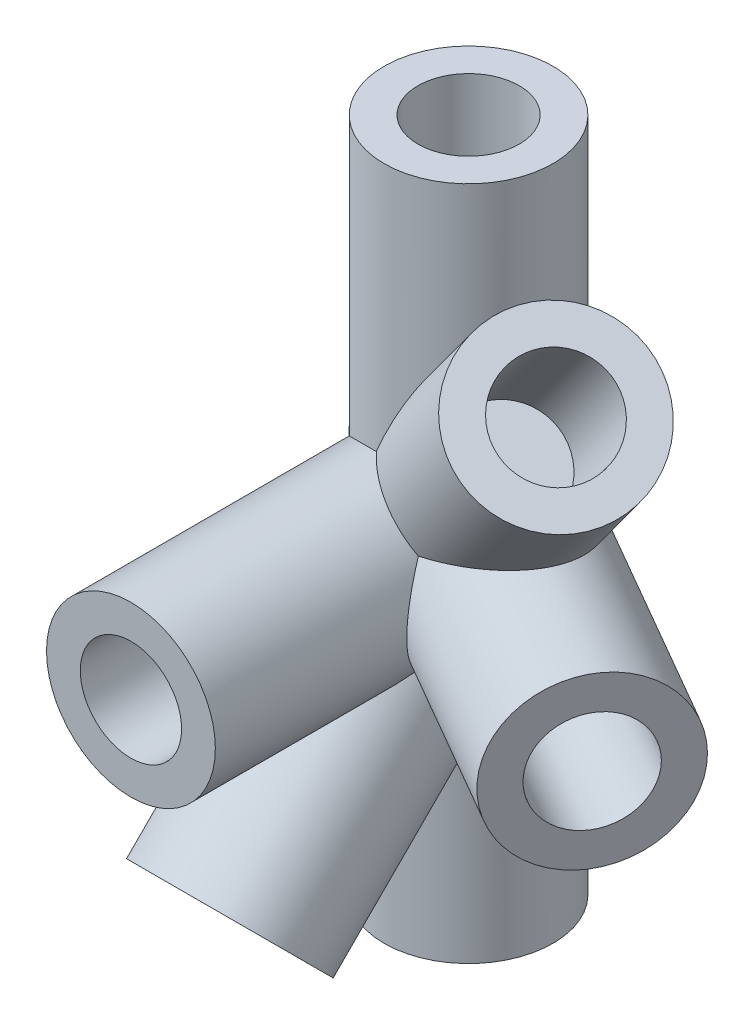
ISO-10303-21;
HEADER;
FILE_DESCRIPTION(('STEP AP214'),'2;1');
FILE_NAME('part.step','',(''),(''),'','','');
FILE_SCHEMA(('AUTOMOTIVE_DESIGN { 1 0 10303 214 1 1 1 1 }'));
ENDSEC;
DATA;
#1=APPLICATION_CONTEXT('core data for automotive mechanical design processes');
#2=APPLICATION_PROTOCOL_DEFINITION('international standard','automotive_design',2000,#1);
#3=PRODUCT_CONTEXT('',#1,'mechanical');
#4=PRODUCT('Part','Part','',(#3));
#5=PRODUCT_RELATED_PRODUCT_CATEGORY('part','',(#4));
#6=PRODUCT_DEFINITION_FORMATION('','',#4);
#7=PRODUCT_DEFINITION_CONTEXT('part definition',#1,'design');
#8=PRODUCT_DEFINITION('design','',#6,#7);
#9=PRODUCT_DEFINITION_SHAPE('','',#8);
#10=(LENGTH_UNIT() NAMED_UNIT(*) SI_UNIT(.MILLI.,.METRE.));
#11=(NAMED_UNIT(*) PLANE_ANGLE_UNIT() SI_UNIT($,.RADIAN.));
#12=(NAMED_UNIT(*) SI_UNIT($,.STERADIAN.) SOLID_ANGLE_UNIT());
#13=UNCERTAINTY_MEASURE_WITH_UNIT(LENGTH_MEASURE(1.E-05),#10,'distance_accuracy_value','');
#14=(GEOMETRIC_REPRESENTATION_CONTEXT(3) GLOBAL_UNCERTAINTY_ASSIGNED_CONTEXT((#13)) GLOBAL_UNIT_ASSIGNED_CONTEXT((#10,
#11,#12)) REPRESENTATION_CONTEXT('',''));
#15=CARTESIAN_POINT('',(0.,0.,0.));
#16=DIRECTION('',(0.,0.,1.));
#17=DIRECTION('',(1.,0.,0.));
#18=AXIS2_PLACEMENT_3D('',#15,#16,#17);
#19=CARTESIAN_POINT('',(20.6349642678086,20.,11.9136021747375));
#20=DIRECTION('',(-0.86602540378444,0.,-0.499999999999998));
#21=DIRECTION('',(-0.499999999999998,0.,0.86602540378444));
#22=AXIS2_PLACEMENT_3D('',#19,#20,#21);
#23=CYLINDRICAL_SURFACE('',#22,5.);
#24=CARTESIAN_POINT('',(17.3205080756888,20.,9.99999999999995));
#25=DIRECTION('',(0.86602540378444,0.,0.499999999999998));
#26=DIRECTION('',(0.499999999999998,0.,-0.86602540378444));
#27=AXIS2_PLACEMENT_3D('',#24,#25,#26);
#28=CIRCLE('',#27,5.);
#29=CARTESIAN_POINT('',(19.8205080756888,20.,5.66987298107775));
#30=VERTEX_POINT('',#29);
#31=EDGE_CURVE('E77',#30,#30,#28,.T.);
#32=ORIENTED_EDGE('',*,*,#31,.F.);
#33=EDGE_LOOP('',(#32));
#34=FACE_BOUND('',#33,.T.);
#35=CARTESIAN_POINT('',(0.,20.,0.));
#36=DIRECTION('',(-0.331413574035592,0.923879532511287,-0.191341716182543));
#37=DIRECTION('',(-0.800103145191267,-0.38268343236509,-0.461939766255641));
#38=AXIS2_PLACEMENT_3D('',#35,#36,#37);
#39=ELLIPSE('',#38,13.0656296487638,5.);
#40=CARTESIAN_POINT('',(4.06259960034373,22.9146671314726,7.03662891860434));
#41=VERTEX_POINT('',#40);
#42=CARTESIAN_POINT('',(2.49999999999999,20.,-4.3301270189222));
#43=VERTEX_POINT('',#42);
#44=EDGE_CURVE('E80',#41,#43,#39,.T.);
#45=ORIENTED_EDGE('',*,*,#44,.F.);
#46=CARTESIAN_POINT('',(0.,20.,0.));
#47=DIRECTION('',(0.866025403784438,0.,-0.500000000000001));
#48=DIRECTION('',(-0.500000000000001,0.,-0.866025403784438));
#49=AXIS2_PLACEMENT_3D('',#46,#47,#48);
#50=ELLIPSE('',#49,9.99999999999998,5.);
#51=CARTESIAN_POINT('',(4.06259960034373,17.0853328685274,7.03662891860434));
#52=VERTEX_POINT('',#51);
#53=EDGE_CURVE('E68',#41,#52,#50,.T.);
#54=ORIENTED_EDGE('',*,*,#53,.T.);
#55=CARTESIAN_POINT('',(0.,20.,0.));
#56=DIRECTION('',(0.761639225784925,0.621875823753831,-0.182143211721529));
#57=DIRECTION('',(-0.526354012893032,0.429766251884748,-0.733656882917578));
#58=AXIS2_PLACEMENT_3D('',#55,#56,#57);
#59=ELLIPSE('',#58,8.79465224064609,5.);
#60=CARTESIAN_POINT('',(4.5554755796027,15.0243519749615,2.06098089356585));
#61=VERTEX_POINT('',#60);
#62=EDGE_CURVE('E44',#52,#61,#59,.T.);
#63=ORIENTED_EDGE('',*,*,#62,.T.);
#64=CARTESIAN_POINT('',(0.,20.,0.));
#65=DIRECTION('',(-0.612372435695795,-0.707106781186547,-0.353553390593272));
#66=DIRECTION('',(0.612372435695795,-0.707106781186547,0.353553390593272));
#67=AXIS2_PLACEMENT_3D('',#64,#65,#66);
#68=ELLIPSE('',#67,7.07106781186548,5.);
#69=EDGE_CURVE('E76',#61,#43,#68,.F.);
#70=ORIENTED_EDGE('',*,*,#69,.T.);
#71=EDGE_LOOP('',(#45,#54,#63,#70));
#72=FACE_BOUND('',#71,.T.);
#73=ADVANCED_FACE('F36',(#34,#72),#23,.T.);
#74=CARTESIAN_POINT('',(0.,40.,0.));
#75=DIRECTION('',(0.,-1.,0.));
#76=DIRECTION('',(0.,0.,-1.));
#77=AXIS2_PLACEMENT_3D('',#74,#75,#76);
#78=CYLINDRICAL_SURFACE('',#77,5.);
#79=CARTESIAN_POINT('',(0.,40.,0.));
#80=DIRECTION('',(0.,1.,0.));
#81=DIRECTION('',(0.,0.,1.));
#82=AXIS2_PLACEMENT_3D('',#79,#80,#81);
#83=CIRCLE('',#82,5.);
#84=CARTESIAN_POINT('',(0.,40.,5.));
#85=VERTEX_POINT('',#84);
#86=EDGE_CURVE('E103',#85,#85,#83,.T.);
#87=ORIENTED_EDGE('',*,*,#86,.F.);
#88=EDGE_LOOP('',(#87));
#89=FACE_BOUND('',#88,.T.);
#90=CARTESIAN_POINT('',(0.,0.,0.));
#91=DIRECTION('',(0.,1.,0.));
#92=DIRECTION('',(0.,0.,1.));
#93=AXIS2_PLACEMENT_3D('',#90,#91,#92);
#94=CIRCLE('',#93,5.);
#95=CARTESIAN_POINT('',(0.,0.,5.));
#96=VERTEX_POINT('',#95);
#97=EDGE_CURVE('E102',#96,#96,#94,.T.);
#98=ORIENTED_EDGE('',*,*,#97,.T.);
#99=EDGE_LOOP('',(#98));
#100=FACE_BOUND('',#99,.T.);
#101=CARTESIAN_POINT('',(0.,20.,0.));
#102=DIRECTION('',(0.800103145191267,-0.38268343236509,0.461939766255641));
#103=DIRECTION('',(-0.331413574035593,-0.923879532511287,-0.191341716182544));
#104=AXIS2_PLACEMENT_3D('',#101,#102,#103);
#105=ELLIPSE('',#104,13.0656296487638,5.);
#106=CARTESIAN_POINT('',(-0.492875979258956,24.9756480250385,4.9756480250385));
#107=VERTEX_POINT('',#106);
#108=EDGE_CURVE('E56',#43,#107,#105,.T.);
#109=ORIENTED_EDGE('',*,*,#108,.F.);
#110=ORIENTED_EDGE('',*,*,#69,.F.);
#111=CARTESIAN_POINT('',(0.,20.,0.));
#112=DIRECTION('',(0.,-0.38268343236509,-0.923879532511287));
#113=DIRECTION('',(0.,-0.923879532511287,0.38268343236509));
#114=AXIS2_PLACEMENT_3D('',#111,#112,#113);
#115=ELLIPSE('',#114,13.0656296487638,5.);
#116=CARTESIAN_POINT('',(-5.,20.,0.));
#117=VERTEX_POINT('',#116);
#118=EDGE_CURVE('E97',#117,#61,#115,.F.);
#119=ORIENTED_EDGE('',*,*,#118,.F.);
#120=CARTESIAN_POINT('',(0.,20.,0.));
#121=DIRECTION('',(0.,-0.707106781186547,0.707106781186547));
#122=DIRECTION('',(0.,-0.707106781186547,-0.707106781186547));
#123=AXIS2_PLACEMENT_3D('',#120,#121,#122);
#124=ELLIPSE('',#123,7.07106781186548,5.);
#125=EDGE_CURVE('E106',#107,#117,#124,.T.);
#126=ORIENTED_EDGE('',*,*,#125,.F.);
#127=EDGE_LOOP('',(#109,#110,#119,#126));
#128=FACE_BOUND('',#127,.T.);
#129=ADVANCED_FACE('F38',(#89,#100,#128),#78,.T.);
#130=CARTESIAN_POINT('',(0.,20.,20.));
#131=DIRECTION('',(0.,0.,-1.));
#132=DIRECTION('',(-1.,0.,0.));
#133=AXIS2_PLACEMENT_3D('',#130,#131,#132);
#134=CYLINDRICAL_SURFACE('',#133,5.);
#135=CARTESIAN_POINT('',(0.,20.,20.));
#136=DIRECTION('',(0.,0.,1.));
#137=DIRECTION('',(1.,0.,0.));
#138=AXIS2_PLACEMENT_3D('',#135,#136,#137);
#139=CIRCLE('',#138,5.);
#140=CARTESIAN_POINT('',(5.,20.,20.));
#141=VERTEX_POINT('',#140);
#142=EDGE_CURVE('E99',#141,#141,#139,.T.);
#143=ORIENTED_EDGE('',*,*,#142,.F.);
#144=EDGE_LOOP('',(#143));
#145=FACE_BOUND('',#144,.T.);
#146=CARTESIAN_POINT('',(0.,20.,0.));
#147=DIRECTION('',(0.538560261370193,0.621875823753831,-0.568527312187694));
#148=DIRECTION('',(-0.372188491821415,-0.429766251884748,-0.822664388008036));
#149=AXIS2_PLACEMENT_3D('',#146,#147,#148);
#150=ELLIPSE('',#149,8.79465224064609,5.);
#151=EDGE_CURVE('E11',#107,#41,#150,.T.);
#152=ORIENTED_EDGE('',*,*,#151,.F.);
#153=ORIENTED_EDGE('',*,*,#125,.T.);
#154=CARTESIAN_POINT('',(0.,20.,0.));
#155=DIRECTION('',(0.,-0.923879532511287,-0.38268343236509));
#156=DIRECTION('',(0.,0.38268343236509,-0.923879532511287));
#157=AXIS2_PLACEMENT_3D('',#154,#155,#156);
#158=ELLIPSE('',#157,13.0656296487638,5.);
#159=EDGE_CURVE('E72',#52,#117,#158,.T.);
#160=ORIENTED_EDGE('',*,*,#159,.F.);
#161=ORIENTED_EDGE('',*,*,#53,.F.);
#162=EDGE_LOOP('',(#152,#153,#160,#161));
#163=FACE_BOUND('',#162,.T.);
#164=ADVANCED_FACE('F70',(#145,#163),#134,.T.);
#165=CARTESIAN_POINT('',(0.,5.85786437626906,14.1421356237309));
#166=DIRECTION('',(0.,0.707106781186547,-0.707106781186548));
#167=DIRECTION('',(0.,0.707106781186548,0.707106781186547));
#168=AXIS2_PLACEMENT_3D('',#165,#166,#167);
#169=CYLINDRICAL_SURFACE('',#168,5.);
#170=CARTESIAN_POINT('',(0.,5.85786437626906,14.1421356237309));
#171=DIRECTION('',(0.,-0.707106781186547,0.707106781186548));
#172=DIRECTION('',(0.,-0.707106781186548,-0.707106781186547));
#173=AXIS2_PLACEMENT_3D('',#170,#171,#172);
#174=CIRCLE('',#173,5.);
#175=CARTESIAN_POINT('',(0.,2.32233047033632,10.6066017177982));
#176=VERTEX_POINT('',#175);
#177=EDGE_CURVE('E94',#176,#176,#174,.T.);
#178=ORIENTED_EDGE('',*,*,#177,.F.);
#179=EDGE_LOOP('',(#178));
#180=FACE_BOUND('',#179,.T.);
#181=ORIENTED_EDGE('',*,*,#62,.F.);
#182=ORIENTED_EDGE('',*,*,#159,.T.);
#183=ORIENTED_EDGE('',*,*,#118,.T.);
#184=EDGE_LOOP('',(#181,#182,#183));
#185=FACE_BOUND('',#184,.T.);
#186=ADVANCED_FACE('F111',(#180,#185),#169,.T.);
#187=CARTESIAN_POINT('',(0.,40.,0.));
#188=DIRECTION('',(0.,1.,0.));
#189=DIRECTION('',(0.,0.,1.));
#190=AXIS2_PLACEMENT_3D('',#187,#188,#189);
#191=PLANE('',#190);
#192=CARTESIAN_POINT('',(0.,40.,0.));
#193=DIRECTION('',(0.,1.,0.));
#194=DIRECTION('',(0.,0.,1.));
#195=AXIS2_PLACEMENT_3D('',#192,#193,#194);
#196=CIRCLE('',#195,3.);
#197=CARTESIAN_POINT('',(0.,40.,3.));
#198=VERTEX_POINT('',#197);
#199=EDGE_CURVE('E239',#198,#198,#196,.T.);
#200=ORIENTED_EDGE('',*,*,#199,.F.);
#201=EDGE_LOOP('',(#200));
#202=FACE_BOUND('',#201,.T.);
#203=ORIENTED_EDGE('',*,*,#86,.T.);
#204=EDGE_LOOP('',(#203));
#205=FACE_BOUND('',#204,.T.);
#206=ADVANCED_FACE('F130',(#202,#205),#191,.T.);
#207=CARTESIAN_POINT('',(0.,0.,0.));
#208=DIRECTION('',(0.,1.,0.));
#209=DIRECTION('',(0.,0.,1.));
#210=AXIS2_PLACEMENT_3D('',#207,#208,#209);
#211=PLANE('',#210);
#212=CARTESIAN_POINT('',(0.,0.,0.));
#213=DIRECTION('',(0.,-1.,0.));
#214=DIRECTION('',(0.,0.,-1.));
#215=AXIS2_PLACEMENT_3D('',#212,#213,#214);
#216=CIRCLE('',#215,3.);
#217=CARTESIAN_POINT('',(0.,0.,-3.));
#218=VERTEX_POINT('',#217);
#219=EDGE_CURVE('E233',#218,#218,#216,.T.);
#220=ORIENTED_EDGE('',*,*,#219,.F.);
#221=EDGE_LOOP('',(#220));
#222=FACE_BOUND('',#221,.T.);
#223=ORIENTED_EDGE('',*,*,#97,.F.);
#224=EDGE_LOOP('',(#223));
#225=FACE_BOUND('',#224,.T.);
#226=ADVANCED_FACE('F127',(#222,#225),#211,.F.);
#227=CARTESIAN_POINT('',(0.,20.,20.));
#228=DIRECTION('',(0.,0.,1.));
#229=DIRECTION('',(1.,0.,0.));
#230=AXIS2_PLACEMENT_3D('',#227,#228,#229);
#231=PLANE('',#230);
#232=CARTESIAN_POINT('',(0.,20.,20.));
#233=DIRECTION('',(0.,0.,1.));
#234=DIRECTION('',(1.,0.,0.));
#235=AXIS2_PLACEMENT_3D('',#232,#233,#234);
#236=CIRCLE('',#235,3.);
#237=CARTESIAN_POINT('',(3.,20.,20.));
#238=VERTEX_POINT('',#237);
#239=EDGE_CURVE('E222',#238,#238,#236,.T.);
#240=ORIENTED_EDGE('',*,*,#239,.F.);
#241=EDGE_LOOP('',(#240));
#242=FACE_BOUND('',#241,.T.);
#243=ORIENTED_EDGE('',*,*,#142,.T.);
#244=EDGE_LOOP('',(#243));
#245=FACE_BOUND('',#244,.T.);
#246=ADVANCED_FACE('F129',(#242,#245),#231,.T.);
#247=CARTESIAN_POINT('',(0.,5.85786437626906,14.1421356237309));
#248=DIRECTION('',(0.,-0.707106781186547,0.707106781186548));
#249=DIRECTION('',(0.,-0.707106781186548,-0.707106781186547));
#250=AXIS2_PLACEMENT_3D('',#247,#248,#249);
#251=PLANE('',#250);
#252=CARTESIAN_POINT('',(0.,5.85786437626906,14.1421356237309));
#253=DIRECTION('',(0.,-0.707106781186548,0.707106781186548));
#254=DIRECTION('',(0.,-0.707106781186548,-0.707106781186548));
#255=AXIS2_PLACEMENT_3D('',#252,#253,#254);
#256=CIRCLE('',#255,3.);
#257=CARTESIAN_POINT('',(0.,3.73654403270942,12.0208152801713));
#258=VERTEX_POINT('',#257);
#259=EDGE_CURVE('E227',#258,#258,#256,.T.);
#260=ORIENTED_EDGE('',*,*,#259,.F.);
#261=EDGE_LOOP('',(#260));
#262=FACE_BOUND('',#261,.T.);
#263=ORIENTED_EDGE('',*,*,#177,.T.);
#264=EDGE_LOOP('',(#263));
#265=FACE_BOUND('',#264,.T.);
#266=ADVANCED_FACE('F136',(#262,#265),#251,.T.);
#267=CARTESIAN_POINT('',(17.3205080756888,20.,9.99999999999995));
#268=DIRECTION('',(0.86602540378444,0.,0.499999999999998));
#269=DIRECTION('',(0.499999999999998,0.,-0.86602540378444));
#270=AXIS2_PLACEMENT_3D('',#267,#268,#269);
#271=PLANE('',#270);
#272=CARTESIAN_POINT('',(17.3205080756888,20.,9.99999999999995));
#273=DIRECTION('',(0.86602540378444,0.,0.499999999999998));
#274=DIRECTION('',(0.499999999999998,0.,-0.86602540378444));
#275=AXIS2_PLACEMENT_3D('',#272,#273,#274);
#276=CIRCLE('',#275,3.);
#277=CARTESIAN_POINT('',(18.8205080756888,20.,7.40192378864663));
#278=VERTEX_POINT('',#277);
#279=EDGE_CURVE('E212',#278,#278,#276,.T.);
#280=ORIENTED_EDGE('',*,*,#279,.F.);
#281=EDGE_LOOP('',(#280));
#282=FACE_BOUND('',#281,.T.);
#283=ORIENTED_EDGE('',*,*,#31,.T.);
#284=EDGE_LOOP('',(#283));
#285=FACE_BOUND('',#284,.T.);
#286=ADVANCED_FACE('F147',(#282,#285),#271,.T.);
#287=CARTESIAN_POINT('',(12.2474487139159,34.142135623731,7.07106781186546));
#288=DIRECTION('',(-0.612372435695796,-0.707106781186547,-0.353553390593273));
#289=DIRECTION('',(0.755928946018454,-0.654653670707978,0.));
#290=AXIS2_PLACEMENT_3D('',#287,#288,#289);
#291=CYLINDRICAL_SURFACE('',#290,5.);
#292=CARTESIAN_POINT('',(12.2474487139159,34.142135623731,7.07106781186546));
#293=DIRECTION('',(0.612372435695796,0.707106781186547,0.353553390593273));
#294=DIRECTION('',(-0.755928946018454,0.654653670707978,0.));
#295=AXIS2_PLACEMENT_3D('',#292,#293,#294);
#296=CIRCLE('',#295,5.);
#297=CARTESIAN_POINT('',(8.46780398382366,37.4154039772708,7.07106781186546));
#298=VERTEX_POINT('',#297);
#299=EDGE_CURVE('E84',#298,#298,#296,.T.);
#300=ORIENTED_EDGE('',*,*,#299,.F.);
#301=EDGE_LOOP('',(#300));
#302=FACE_BOUND('',#301,.T.);
#303=ORIENTED_EDGE('',*,*,#151,.T.);
#304=ORIENTED_EDGE('',*,*,#44,.T.);
#305=ORIENTED_EDGE('',*,*,#108,.T.);
#306=EDGE_LOOP('',(#303,#304,#305));
#307=FACE_BOUND('',#306,.T.);
#308=ADVANCED_FACE('F83',(#302,#307),#291,.T.);
#309=CARTESIAN_POINT('',(12.2474487139159,34.142135623731,7.07106781186546));
#310=DIRECTION('',(0.612372435695796,0.707106781186547,0.353553390593273));
#311=DIRECTION('',(-0.755928946018454,0.654653670707978,0.));
#312=AXIS2_PLACEMENT_3D('',#309,#310,#311);
#313=PLANE('',#312);
#314=CARTESIAN_POINT('',(12.2474487139159,34.142135623731,7.07106781186546));
#315=DIRECTION('',(0.612372435695796,0.707106781186547,0.353553390593272));
#316=DIRECTION('',(-0.755928946018454,0.654653670707978,0.));
#317=AXIS2_PLACEMENT_3D('',#314,#315,#316);
#318=CIRCLE('',#317,3.);
#319=CARTESIAN_POINT('',(9.97966187586057,36.1060966358549,7.07106781186546));
#320=VERTEX_POINT('',#319);
#321=EDGE_CURVE('E213',#320,#320,#318,.T.);
#322=ORIENTED_EDGE('',*,*,#321,.F.);
#323=EDGE_LOOP('',(#322));
#324=FACE_BOUND('',#323,.T.);
#325=ORIENTED_EDGE('',*,*,#299,.T.);
#326=EDGE_LOOP('',(#325));
#327=FACE_BOUND('',#326,.T.);
#328=ADVANCED_FACE('F155',(#324,#327),#313,.T.);
#329=CARTESIAN_POINT('',(0.,28.,0.));
#330=DIRECTION('',(0.,1.,0.));
#331=DIRECTION('',(0.,0.,1.));
#332=AXIS2_PLACEMENT_3D('',#329,#330,#331);
#333=CYLINDRICAL_SURFACE('',#332,3.);
#334=CARTESIAN_POINT('',(0.,28.,0.));
#335=DIRECTION('',(0.,1.,0.));
#336=DIRECTION('',(0.,0.,1.));
#337=AXIS2_PLACEMENT_3D('',#334,#335,#336);
#338=CIRCLE('',#337,3.);
#339=CARTESIAN_POINT('',(0.,28.,3.));
#340=VERTEX_POINT('',#339);
#341=EDGE_CURVE('E87',#340,#340,#338,.T.);
#342=ORIENTED_EDGE('',*,*,#341,.F.);
#343=EDGE_LOOP('',(#342));
#344=FACE_BOUND('',#343,.T.);
#345=ORIENTED_EDGE('',*,*,#199,.T.);
#346=EDGE_LOOP('',(#345));
#347=FACE_BOUND('',#346,.T.);
#348=ADVANCED_FACE('F159',(#344,#347),#333,.F.);
#349=CARTESIAN_POINT('',(0.,28.,0.));
#350=DIRECTION('',(0.,1.,0.));
#351=DIRECTION('',(0.,0.,1.));
#352=AXIS2_PLACEMENT_3D('',#349,#350,#351);
#353=PLANE('',#352);
#354=ORIENTED_EDGE('',*,*,#341,.T.);
#355=EDGE_LOOP('',(#354));
#356=FACE_BOUND('',#355,.T.);
#357=ADVANCED_FACE('F163',(#356),#353,.T.);
#358=CARTESIAN_POINT('',(0.,12.,0.));
#359=DIRECTION('',(0.,-1.,0.));
#360=DIRECTION('',(0.,0.,-1.));
#361=AXIS2_PLACEMENT_3D('',#358,#359,#360);
#362=CYLINDRICAL_SURFACE('',#361,3.);
#363=CARTESIAN_POINT('',(0.,12.,0.));
#364=DIRECTION('',(0.,-1.,0.));
#365=DIRECTION('',(0.,0.,-1.));
#366=AXIS2_PLACEMENT_3D('',#363,#364,#365);
#367=CIRCLE('',#366,3.);
#368=CARTESIAN_POINT('',(0.,12.,-3.));
#369=VERTEX_POINT('',#368);
#370=EDGE_CURVE('E236',#369,#369,#367,.T.);
#371=ORIENTED_EDGE('',*,*,#370,.F.);
#372=EDGE_LOOP('',(#371));
#373=FACE_BOUND('',#372,.T.);
#374=ORIENTED_EDGE('',*,*,#219,.T.);
#375=EDGE_LOOP('',(#374));
#376=FACE_BOUND('',#375,.T.);
#377=ADVANCED_FACE('F167',(#373,#376),#362,.F.);
#378=CARTESIAN_POINT('',(0.,12.,0.));
#379=DIRECTION('',(0.,-1.,0.));
#380=DIRECTION('',(0.,0.,-1.));
#381=AXIS2_PLACEMENT_3D('',#378,#379,#380);
#382=PLANE('',#381);
#383=ORIENTED_EDGE('',*,*,#370,.T.);
#384=EDGE_LOOP('',(#383));
#385=FACE_BOUND('',#384,.T.);
#386=ADVANCED_FACE('F171',(#385),#382,.T.);
#387=CARTESIAN_POINT('',(0.,14.3431457505076,5.65685424949238));
#388=DIRECTION('',(0.,-0.707106781186547,0.707106781186547));
#389=DIRECTION('',(0.,-0.707106781186548,-0.707106781186548));
#390=AXIS2_PLACEMENT_3D('',#387,#388,#389);
#391=CYLINDRICAL_SURFACE('',#390,3.);
#392=CARTESIAN_POINT('',(0.,14.3431457505076,5.65685424949238));
#393=DIRECTION('',(0.,-0.707106781186548,0.707106781186548));
#394=DIRECTION('',(0.,-0.707106781186548,-0.707106781186548));
#395=AXIS2_PLACEMENT_3D('',#392,#393,#394);
#396=CIRCLE('',#395,3.);
#397=CARTESIAN_POINT('',(0.,12.221825406948,3.53553390593273));
#398=VERTEX_POINT('',#397);
#399=EDGE_CURVE('E230',#398,#398,#396,.T.);
#400=ORIENTED_EDGE('',*,*,#399,.F.);
#401=EDGE_LOOP('',(#400));
#402=FACE_BOUND('',#401,.T.);
#403=ORIENTED_EDGE('',*,*,#259,.T.);
#404=EDGE_LOOP('',(#403));
#405=FACE_BOUND('',#404,.T.);
#406=ADVANCED_FACE('F175',(#402,#405),#391,.F.);
#407=CARTESIAN_POINT('',(0.,14.3431457505076,5.65685424949238));
#408=DIRECTION('',(0.,-0.707106781186548,0.707106781186548));
#409=DIRECTION('',(0.,-0.707106781186548,-0.707106781186548));
#410=AXIS2_PLACEMENT_3D('',#407,#408,#409);
#411=PLANE('',#410);
#412=ORIENTED_EDGE('',*,*,#399,.T.);
#413=EDGE_LOOP('',(#412));
#414=FACE_BOUND('',#413,.T.);
#415=ADVANCED_FACE('F179',(#414),#411,.T.);
#416=CARTESIAN_POINT('',(0.,20.,8.));
#417=DIRECTION('',(0.,0.,1.));
#418=DIRECTION('',(1.,0.,0.));
#419=AXIS2_PLACEMENT_3D('',#416,#417,#418);
#420=CYLINDRICAL_SURFACE('',#419,3.);
#421=CARTESIAN_POINT('',(0.,20.,8.));
#422=DIRECTION('',(0.,0.,1.));
#423=DIRECTION('',(1.,0.,0.));
#424=AXIS2_PLACEMENT_3D('',#421,#422,#423);
#425=CIRCLE('',#424,3.);
#426=CARTESIAN_POINT('',(3.,20.,8.));
#427=VERTEX_POINT('',#426);
#428=EDGE_CURVE('E224',#427,#427,#425,.T.);
#429=ORIENTED_EDGE('',*,*,#428,.F.);
#430=EDGE_LOOP('',(#429));
#431=FACE_BOUND('',#430,.T.);
#432=ORIENTED_EDGE('',*,*,#239,.T.);
#433=EDGE_LOOP('',(#432));
#434=FACE_BOUND('',#433,.T.);
#435=ADVANCED_FACE('F183',(#431,#434),#420,.F.);
#436=CARTESIAN_POINT('',(0.,20.,8.));
#437=DIRECTION('',(0.,0.,1.));
#438=DIRECTION('',(1.,0.,0.));
#439=AXIS2_PLACEMENT_3D('',#436,#437,#438);
#440=PLANE('',#439);
#441=ORIENTED_EDGE('',*,*,#428,.T.);
#442=EDGE_LOOP('',(#441));
#443=FACE_BOUND('',#442,.T.);
#444=ADVANCED_FACE('F187',(#443),#440,.T.);
#445=CARTESIAN_POINT('',(6.92820323027552,20.,3.99999999999998));
#446=DIRECTION('',(0.86602540378444,0.,0.499999999999998));
#447=DIRECTION('',(0.499999999999998,0.,-0.86602540378444));
#448=AXIS2_PLACEMENT_3D('',#445,#446,#447);
#449=CYLINDRICAL_SURFACE('',#448,3.);
#450=CARTESIAN_POINT('',(6.92820323027552,20.,3.99999999999998));
#451=DIRECTION('',(0.86602540378444,0.,0.499999999999998));
#452=DIRECTION('',(0.499999999999998,0.,-0.86602540378444));
#453=AXIS2_PLACEMENT_3D('',#450,#451,#452);
#454=CIRCLE('',#453,3.);
#455=CARTESIAN_POINT('',(8.42820323027551,20.,1.40192378864666));
#456=VERTEX_POINT('',#455);
#457=EDGE_CURVE('E216',#456,#456,#454,.T.);
#458=ORIENTED_EDGE('',*,*,#457,.F.);
#459=EDGE_LOOP('',(#458));
#460=FACE_BOUND('',#459,.T.);
#461=ORIENTED_EDGE('',*,*,#279,.T.);
#462=EDGE_LOOP('',(#461));
#463=FACE_BOUND('',#462,.T.);
#464=ADVANCED_FACE('F191',(#460,#463),#449,.F.);
#465=CARTESIAN_POINT('',(6.92820323027552,20.,3.99999999999998));
#466=DIRECTION('',(0.86602540378444,0.,0.499999999999998));
#467=DIRECTION('',(0.499999999999998,0.,-0.86602540378444));
#468=AXIS2_PLACEMENT_3D('',#465,#466,#467);
#469=PLANE('',#468);
#470=ORIENTED_EDGE('',*,*,#457,.T.);
#471=EDGE_LOOP('',(#470));
#472=FACE_BOUND('',#471,.T.);
#473=ADVANCED_FACE('F195',(#472),#469,.T.);
#474=CARTESIAN_POINT('',(4.89897948556638,25.6568542494924,2.82842712474619));
#475=DIRECTION('',(0.612372435695796,0.707106781186547,0.353553390593272));
#476=DIRECTION('',(-0.755928946018454,0.654653670707978,0.));
#477=AXIS2_PLACEMENT_3D('',#474,#475,#476);
#478=CYLINDRICAL_SURFACE('',#477,3.);
#479=CARTESIAN_POINT('',(4.89897948556638,25.6568542494924,2.82842712474619));
#480=DIRECTION('',(0.612372435695796,0.707106781186547,0.353553390593272));
#481=DIRECTION('',(-0.755928946018454,0.654653670707978,0.));
#482=AXIS2_PLACEMENT_3D('',#479,#480,#481);
#483=CIRCLE('',#482,3.);
#484=CARTESIAN_POINT('',(2.63119264751102,27.6208152616163,2.82842712474619));
#485=VERTEX_POINT('',#484);
#486=EDGE_CURVE('E211',#485,#485,#483,.T.);
#487=CARTESIAN_POINT('',(2.63119264751102,27.6208152616163,2.82842712474619));
#488=CARTESIAN_POINT('',(2.707739201973,27.7092036092646,2.87262129857035));
#489=CARTESIAN_POINT('',(2.78428575643497,27.797591956913,2.91681547239451));
#490=CARTESIAN_POINT('',(2.93737886535892,27.9743686522096,3.00520382004282));
#491=CARTESIAN_POINT('',(3.0139254198209,28.0627569998579,3.04939799386698));
#492=CARTESIAN_POINT('',(3.16701852874484,28.2395336951546,3.1377863415153));
#493=CARTESIAN_POINT('',(3.24356508320682,28.3279220428029,3.18198051533946));
#494=CARTESIAN_POINT('',(3.39665819213077,28.5046987380995,3.27036886298778));
#495=CARTESIAN_POINT('',(3.47320474659274,28.5930870857478,3.31456303681194));
#496=CARTESIAN_POINT('',(3.62629785551669,28.7698637810445,3.40295138446026));
#497=CARTESIAN_POINT('',(3.70284440997867,28.8582521286928,3.44714555828442));
#498=CARTESIAN_POINT('',(3.85593751890262,29.0350288239894,3.53553390593273));
#499=CARTESIAN_POINT('',(3.93248407336459,29.1234171716377,3.57972807975689));
#500=CARTESIAN_POINT('',(4.08557718228854,29.3001938669344,3.66811642740521));
#501=CARTESIAN_POINT('',(4.16212373675051,29.3885822145827,3.71231060122937));
#502=CARTESIAN_POINT('',(4.31521684567446,29.5653589098793,3.80069894887769));
#503=CARTESIAN_POINT('',(4.39176340013644,29.6537472575276,3.84489312270185));
#504=CARTESIAN_POINT('',(4.54485650906039,29.8305239528243,3.93328147035016));
#505=CARTESIAN_POINT('',(4.62140306352236,29.9189123004726,3.97747564417432));
#506=CARTESIAN_POINT('',(4.77449617244631,30.0956889957692,4.06586399182264));
#507=CARTESIAN_POINT('',(4.85104272690828,30.1840773434176,4.1100581656468));
#508=CARTESIAN_POINT('',(5.00413583583223,30.3608540387142,4.19844651329512));
#509=CARTESIAN_POINT('',(5.08068239029421,30.4492423863625,4.24264068711928));
#510=CARTESIAN_POINT('',(5.23377549921816,30.6260190816592,4.3310290347676));
#511=CARTESIAN_POINT('',(5.31032205368013,30.7144074293075,4.37522320859176));
#512=CARTESIAN_POINT('',(5.46341516260408,30.8911841246041,4.46361155624007));
#513=CARTESIAN_POINT('',(5.53996171706605,30.9795724722524,4.50780573006423));
#514=CARTESIAN_POINT('',(5.69305482599,31.1563491675491,4.59619407771255));
#515=CARTESIAN_POINT('',(5.76960138045198,31.2447375151974,4.64038825153671));
#516=CARTESIAN_POINT('',(5.92269448937593,31.421514210494,4.72877659918503));
#517=CARTESIAN_POINT('',(5.9992410438379,31.5099025581423,4.77297077300919));
#518=CARTESIAN_POINT('',(6.15233415276185,31.686679253439,4.86135912065751));
#519=CARTESIAN_POINT('',(6.22888070722382,31.7750676010873,4.90555329448166));
#520=CARTESIAN_POINT('',(6.38197381614777,31.9518442963839,4.99394164212998));
#521=CARTESIAN_POINT('',(6.45852037060975,32.0402326440322,5.03813581595414));
#522=CARTESIAN_POINT('',(6.6116134795337,32.2170093393289,5.12652416360246));
#523=CARTESIAN_POINT('',(6.68816003399567,32.3053976869772,5.17071833742662));
#524=CARTESIAN_POINT('',(6.84125314291962,32.4821743822738,5.25910668507494));
#525=CARTESIAN_POINT('',(6.91779969738159,32.5705627299222,5.3033008588991));
#526=CARTESIAN_POINT('',(7.07089280630554,32.7473394252188,5.39168920654741));
#527=CARTESIAN_POINT('',(7.14743936076752,32.8357277728671,5.43588338037157));
#528=CARTESIAN_POINT('',(7.30053246969147,33.0125044681637,5.52427172801989));
#529=CARTESIAN_POINT('',(7.37707902415344,33.1008928158121,5.56846590184405));
#530=CARTESIAN_POINT('',(7.53017213307739,33.2776695111087,5.65685424949237));
#531=CARTESIAN_POINT('',(7.60671868753936,33.366057858757,5.70104842331653));
#532=CARTESIAN_POINT('',(7.75981179646331,33.5428345540537,5.78943677096484));
#533=CARTESIAN_POINT('',(7.83635835092529,33.631222901702,5.833630944789));
#534=CARTESIAN_POINT('',(7.98945145984924,33.8079995969986,5.92201929243732));
#535=CARTESIAN_POINT('',(8.06599801431121,33.8963879446469,5.96621346626148));
#536=CARTESIAN_POINT('',(8.21909112323516,34.0731646399436,6.0546018139098));
#537=CARTESIAN_POINT('',(8.29563767769714,34.1615529875919,6.09879598773396));
#538=CARTESIAN_POINT('',(8.44873078662108,34.3383296828885,6.18718433538228));
#539=CARTESIAN_POINT('',(8.52527734108306,34.4267180305368,6.23137850920643));
#540=CARTESIAN_POINT('',(8.67837045000701,34.6034947258335,6.31976685685475));
#541=CARTESIAN_POINT('',(8.75491700446898,34.6918830734818,6.36396103067891));
#542=CARTESIAN_POINT('',(8.90801011339293,34.8686597687784,6.45234937832723));
#543=CARTESIAN_POINT('',(8.98455666785491,34.9570481164268,6.49654355215139));
#544=CARTESIAN_POINT('',(9.13764977677885,35.1338248117234,6.58493189979971));
#545=CARTESIAN_POINT('',(9.21419633124083,35.2222131593717,6.62912607362387));
#546=CARTESIAN_POINT('',(9.36728944016478,35.3989898546684,6.71751442127218));
#547=CARTESIAN_POINT('',(9.44383599462675,35.4873782023167,6.76170859509634));
#548=CARTESIAN_POINT('',(9.5969291035507,35.6641548976133,6.85009694274466));
#549=CARTESIAN_POINT('',(9.67347565801268,35.7525432452616,6.89429111656882));
#550=CARTESIAN_POINT('',(9.82656876693662,35.9293199405583,6.98267946421714));
#551=CARTESIAN_POINT('',(9.9031153213986,36.0177082882066,7.0268736380413));
#552=CARTESIAN_POINT('',(9.97966187586057,36.1060966358549,7.07106781186546));
#553=B_SPLINE_CURVE_WITH_KNOTS('',3,(#487,#488,#489,#490,#491,#492,#493,#494,#495,#496,#497,
#498,#499,#500,#501,#502,#503,#504,#505,#506,#507,#508,#509,#510,#511,#512,#513,#514,#515,#516,
#517,#518,#519,#520,#521,#522,#523,#524,#525,#526,#527,#528,#529,#530,#531,#532,#533,#534,#535,
#536,#537,#538,#539,#540,#541,#542,#543,#544,#545,#546,#547,#548,#549,#550,#551,#552),
.UNSPECIFIED.,.F.,.F.,(4,2,2,2,2,2,2,2,2,2,2,2,2,2,2,2,2,2,2,2,2,2,2,2,2,2,2,2,2,2,2,2,4),(0.,
0.375000000000002,0.750000000000001,1.125,1.5,1.875,2.25,2.625,3.,3.375,3.75,4.125,4.5,4.875,
5.25,5.625,6.,6.375,6.75,7.125,7.5,7.875,8.25,8.625,9.,9.375,9.75,10.125,10.5,10.875,11.25,
11.625,12.),.UNSPECIFIED.);
#554=EDGE_CURVE('BSEAM199',#485,#320,#553,.T.);
#555=ORIENTED_EDGE('',*,*,#486,.F.);
#556=ORIENTED_EDGE('',*,*,#321,.T.);
#557=ORIENTED_EDGE('',*,*,#554,.T.);
#558=ORIENTED_EDGE('',*,*,#554,.F.);
#559=EDGE_LOOP('',(#555,#557,#556,#558));
#560=FACE_BOUND('',#559,.T.);
#561=ADVANCED_FACE('F199',(#560),#478,.F.);
#562=CARTESIAN_POINT('',(4.89897948556638,25.6568542494924,2.82842712474619));
#563=DIRECTION('',(0.612372435695796,0.707106781186547,0.353553390593272));
#564=DIRECTION('',(-0.755928946018454,0.654653670707978,0.));
#565=AXIS2_PLACEMENT_3D('',#562,#563,#564);
#566=PLANE('',#565);
#567=ORIENTED_EDGE('',*,*,#486,.T.);
#568=EDGE_LOOP('',(#567));
#569=FACE_BOUND('',#568,.T.);
#570=ADVANCED_FACE('F203',(#569),#566,.T.);
#571=CLOSED_SHELL('',(#73,#129,#164,#186,#206,#226,#246,#266,#286,#308,#328,#348,#357,#377,#386,
#406,#415,#435,#444,#464,#473,#561,#570));
#572=MANIFOLD_SOLID_BREP('B2',#571);
#573=ADVANCED_BREP_SHAPE_REPRESENTATION('',(#18,#572),#14);
#574=SHAPE_DEFINITION_REPRESENTATION(#9,#573);
ENDSEC;
END-ISO-10303-21;
